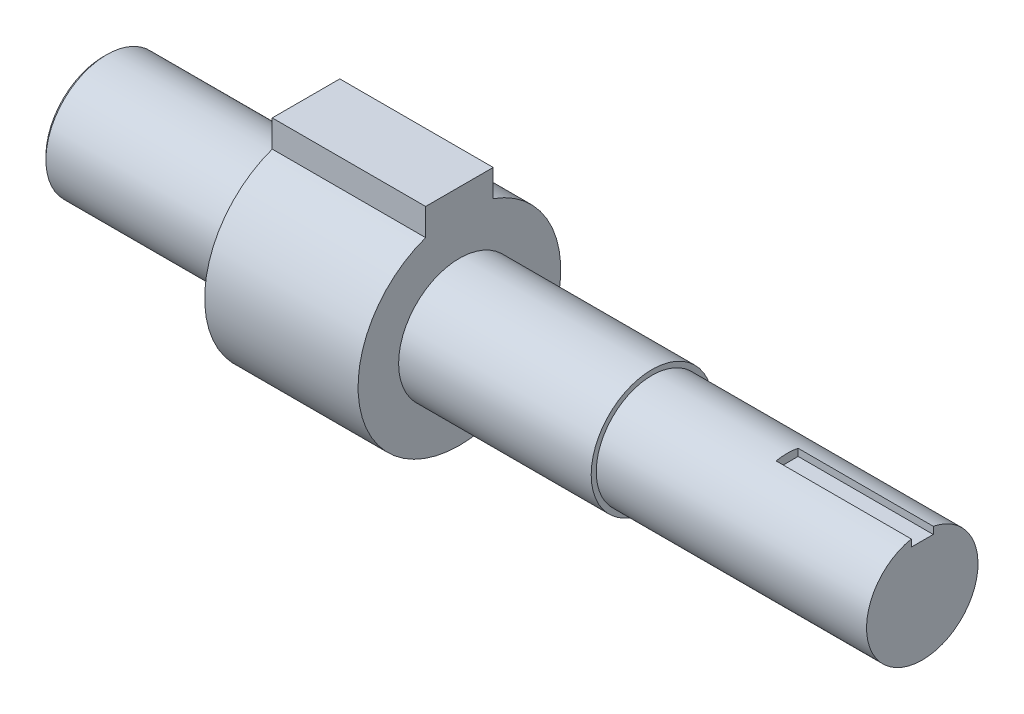
ISO-10303-21;
HEADER;
FILE_DESCRIPTION(('STEP AP214'),'2;1');
FILE_NAME('part.step','',(''),(''),'','','');
FILE_SCHEMA(('AUTOMOTIVE_DESIGN { 1 0 10303 214 1 1 1 1 }'));
ENDSEC;
DATA;
#1=APPLICATION_CONTEXT('core data for automotive mechanical design processes');
#2=APPLICATION_PROTOCOL_DEFINITION('international standard','automotive_design',2000,#1);
#3=PRODUCT_CONTEXT('',#1,'mechanical');
#4=PRODUCT('Part','Part','',(#3));
#5=PRODUCT_RELATED_PRODUCT_CATEGORY('part','',(#4));
#6=PRODUCT_DEFINITION_FORMATION('','',#4);
#7=PRODUCT_DEFINITION_CONTEXT('part definition',#1,'design');
#8=PRODUCT_DEFINITION('design','',#6,#7);
#9=PRODUCT_DEFINITION_SHAPE('','',#8);
#10=(LENGTH_UNIT() NAMED_UNIT(*) SI_UNIT(.MILLI.,.METRE.));
#11=(NAMED_UNIT(*) PLANE_ANGLE_UNIT() SI_UNIT($,.RADIAN.));
#12=(NAMED_UNIT(*) SI_UNIT($,.STERADIAN.) SOLID_ANGLE_UNIT());
#13=UNCERTAINTY_MEASURE_WITH_UNIT(LENGTH_MEASURE(1.E-05),#10,'distance_accuracy_value','');
#14=(GEOMETRIC_REPRESENTATION_CONTEXT(3) GLOBAL_UNCERTAINTY_ASSIGNED_CONTEXT((#13)) GLOBAL_UNIT_ASSIGNED_CONTEXT((#10,
#11,#12)) REPRESENTATION_CONTEXT('',''));
#15=CARTESIAN_POINT('',(0.,0.,0.));
#16=DIRECTION('',(0.,0.,1.));
#17=DIRECTION('',(1.,0.,0.));
#18=AXIS2_PLACEMENT_3D('',#15,#16,#17);
#19=CARTESIAN_POINT('',(0.,0.,0.));
#20=DIRECTION('',(1.,0.,0.));
#21=DIRECTION('',(0.,0.,-1.));
#22=AXIS2_PLACEMENT_3D('',#19,#20,#21);
#23=PLANE('',#22);
#24=CARTESIAN_POINT('',(0.,0.,0.));
#25=DIRECTION('',(1.,0.,0.));
#26=DIRECTION('',(0.,0.,-1.));
#27=AXIS2_PLACEMENT_3D('',#24,#25,#26);
#28=CIRCLE('',#27,8.49999999999998);
#29=CARTESIAN_POINT('',(0.,0.,-8.49999999999998));
#30=VERTEX_POINT('',#29);
#31=EDGE_CURVE('E42',#30,#30,#28,.F.);
#32=ORIENTED_EDGE('',*,*,#31,.T.);
#33=EDGE_LOOP('',(#32));
#34=FACE_BOUND('',#33,.T.);
#35=ADVANCED_FACE('F34',(#34),#23,.F.);
#36=CARTESIAN_POINT('',(0.,0.,0.));
#37=DIRECTION('',(-1.,0.,0.));
#38=DIRECTION('',(0.,0.,1.));
#39=AXIS2_PLACEMENT_3D('',#36,#37,#38);
#40=CYLINDRICAL_SURFACE('',#39,9.);
#41=CARTESIAN_POINT('',(0.500000000000023,0.,0.));
#42=DIRECTION('',(1.,0.,0.));
#43=DIRECTION('',(0.,0.,-1.));
#44=AXIS2_PLACEMENT_3D('',#41,#42,#43);
#45=CIRCLE('',#44,9.);
#46=CARTESIAN_POINT('',(0.500000000000023,0.,-9.));
#47=VERTEX_POINT('',#46);
#48=EDGE_CURVE('E11',#47,#47,#45,.T.);
#49=ORIENTED_EDGE('',*,*,#48,.T.);
#50=EDGE_LOOP('',(#49));
#51=FACE_BOUND('',#50,.T.);
#52=CARTESIAN_POINT('',(30.,0.,0.));
#53=DIRECTION('',(1.,0.,0.));
#54=DIRECTION('',(0.,0.,-1.));
#55=AXIS2_PLACEMENT_3D('',#52,#53,#54);
#56=CIRCLE('',#55,9.);
#57=CARTESIAN_POINT('',(30.,0.,-9.));
#58=VERTEX_POINT('',#57);
#59=EDGE_CURVE('E177',#58,#58,#56,.T.);
#60=ORIENTED_EDGE('',*,*,#59,.F.);
#61=EDGE_LOOP('',(#60));
#62=FACE_BOUND('',#61,.T.);
#63=ADVANCED_FACE('F193',(#51,#62),#40,.T.);
#64=CARTESIAN_POINT('',(52.7,0.,0.));
#65=DIRECTION('',(-1.,0.,0.));
#66=DIRECTION('',(0.,0.,1.));
#67=AXIS2_PLACEMENT_3D('',#64,#65,#66);
#68=CYLINDRICAL_SURFACE('',#67,15.);
#69=CARTESIAN_POINT('',(30.,0.,0.));
#70=DIRECTION('',(1.,0.,0.));
#71=DIRECTION('',(0.,0.,-1.));
#72=AXIS2_PLACEMENT_3D('',#69,#70,#71);
#73=CIRCLE('',#72,15.);
#74=CARTESIAN_POINT('',(30.,14.1421356237309,5.));
#75=VERTEX_POINT('',#74);
#76=CARTESIAN_POINT('',(30.,14.142135623731,-5.));
#77=VERTEX_POINT('',#76);
#78=EDGE_CURVE('E152',#75,#77,#73,.T.);
#79=ORIENTED_EDGE('',*,*,#78,.T.);
#80=DIRECTION('',(-1.,0.,0.));
#81=VECTOR('',#80,1.);
#82=CARTESIAN_POINT('',(52.7,14.142135623731,-5.));
#83=LINE('',#82,#81);
#84=CARTESIAN_POINT('',(52.7,14.142135623731,-5.));
#85=VERTEX_POINT('',#84);
#86=EDGE_CURVE('E175',#85,#77,#83,.T.);
#87=ORIENTED_EDGE('',*,*,#86,.F.);
#88=CARTESIAN_POINT('',(52.7,0.,0.));
#89=DIRECTION('',(1.,0.,0.));
#90=DIRECTION('',(0.,0.,-1.));
#91=AXIS2_PLACEMENT_3D('',#88,#89,#90);
#92=CIRCLE('',#91,15.);
#93=CARTESIAN_POINT('',(52.7,14.1421356237309,5.));
#94=VERTEX_POINT('',#93);
#95=EDGE_CURVE('E155',#94,#85,#92,.T.);
#96=ORIENTED_EDGE('',*,*,#95,.F.);
#97=DIRECTION('',(-1.,0.,0.));
#98=VECTOR('',#97,1.);
#99=CARTESIAN_POINT('',(52.7,14.1421356237309,5.));
#100=LINE('',#99,#98);
#101=EDGE_CURVE('E161',#94,#75,#100,.T.);
#102=ORIENTED_EDGE('',*,*,#101,.T.);
#103=EDGE_LOOP('',(#79,#87,#96,#102));
#104=FACE_BOUND('',#103,.T.);
#105=ADVANCED_FACE('F197',(#104),#68,.T.);
#106=CARTESIAN_POINT('',(52.7,18.142135623731,-5.));
#107=DIRECTION('',(0.,0.,1.));
#108=DIRECTION('',(0.,-1.,0.));
#109=AXIS2_PLACEMENT_3D('',#106,#107,#108);
#110=PLANE('',#109);
#111=DIRECTION('',(0.,1.,0.));
#112=VECTOR('',#111,1.);
#113=CARTESIAN_POINT('',(30.,18.142135623731,-5.));
#114=LINE('',#113,#112);
#115=CARTESIAN_POINT('',(30.,18.142135623731,-5.));
#116=VERTEX_POINT('',#115);
#117=EDGE_CURVE('E164',#77,#116,#114,.T.);
#118=ORIENTED_EDGE('',*,*,#117,.T.);
#119=DIRECTION('',(-1.,0.,0.));
#120=VECTOR('',#119,1.);
#121=CARTESIAN_POINT('',(52.7,18.142135623731,-5.));
#122=LINE('',#121,#120);
#123=CARTESIAN_POINT('',(52.7,18.142135623731,-5.));
#124=VERTEX_POINT('',#123);
#125=EDGE_CURVE('E172',#124,#116,#122,.T.);
#126=ORIENTED_EDGE('',*,*,#125,.F.);
#127=DIRECTION('',(0.,1.,0.));
#128=VECTOR('',#127,1.);
#129=CARTESIAN_POINT('',(52.7,18.142135623731,-5.));
#130=LINE('',#129,#128);
#131=EDGE_CURVE('E87',#85,#124,#130,.T.);
#132=ORIENTED_EDGE('',*,*,#131,.F.);
#133=ORIENTED_EDGE('',*,*,#86,.T.);
#134=EDGE_LOOP('',(#118,#126,#132,#133));
#135=FACE_BOUND('',#134,.T.);
#136=ADVANCED_FACE('F203',(#135),#110,.F.);
#137=CARTESIAN_POINT('',(52.7,18.142135623731,-5.));
#138=DIRECTION('',(0.,-1.,0.));
#139=DIRECTION('',(0.,0.,-1.));
#140=AXIS2_PLACEMENT_3D('',#137,#138,#139);
#141=PLANE('',#140);
#142=DIRECTION('',(0.,0.,1.));
#143=VECTOR('',#142,1.);
#144=CARTESIAN_POINT('',(30.,18.142135623731,-5.));
#145=LINE('',#144,#143);
#146=CARTESIAN_POINT('',(30.,18.142135623731,5.));
#147=VERTEX_POINT('',#146);
#148=EDGE_CURVE('E166',#116,#147,#145,.T.);
#149=ORIENTED_EDGE('',*,*,#148,.T.);
#150=DIRECTION('',(-1.,0.,0.));
#151=VECTOR('',#150,1.);
#152=CARTESIAN_POINT('',(52.7,18.142135623731,5.));
#153=LINE('',#152,#151);
#154=CARTESIAN_POINT('',(52.7,18.142135623731,5.));
#155=VERTEX_POINT('',#154);
#156=EDGE_CURVE('E170',#155,#147,#153,.T.);
#157=ORIENTED_EDGE('',*,*,#156,.F.);
#158=DIRECTION('',(0.,0.,1.));
#159=VECTOR('',#158,1.);
#160=CARTESIAN_POINT('',(52.7,18.142135623731,-5.));
#161=LINE('',#160,#159);
#162=EDGE_CURVE('E158',#124,#155,#161,.T.);
#163=ORIENTED_EDGE('',*,*,#162,.F.);
#164=ORIENTED_EDGE('',*,*,#125,.T.);
#165=EDGE_LOOP('',(#149,#157,#163,#164));
#166=FACE_BOUND('',#165,.T.);
#167=ADVANCED_FACE('F207',(#166),#141,.F.);
#168=CARTESIAN_POINT('',(52.7,18.142135623731,5.));
#169=DIRECTION('',(0.,0.,-1.));
#170=DIRECTION('',(0.,1.,0.));
#171=AXIS2_PLACEMENT_3D('',#168,#169,#170);
#172=PLANE('',#171);
#173=DIRECTION('',(0.,-1.,0.));
#174=VECTOR('',#173,1.);
#175=CARTESIAN_POINT('',(30.,18.142135623731,5.));
#176=LINE('',#175,#174);
#177=EDGE_CURVE('E79',#147,#75,#176,.T.);
#178=ORIENTED_EDGE('',*,*,#177,.T.);
#179=ORIENTED_EDGE('',*,*,#101,.F.);
#180=DIRECTION('',(0.,-1.,0.));
#181=VECTOR('',#180,1.);
#182=CARTESIAN_POINT('',(52.7,18.142135623731,5.));
#183=LINE('',#182,#181);
#184=EDGE_CURVE('E58',#155,#94,#183,.T.);
#185=ORIENTED_EDGE('',*,*,#184,.F.);
#186=ORIENTED_EDGE('',*,*,#156,.T.);
#187=EDGE_LOOP('',(#178,#179,#185,#186));
#188=FACE_BOUND('',#187,.T.);
#189=ADVANCED_FACE('F210',(#188),#172,.F.);
#190=CARTESIAN_POINT('',(52.7,0.,0.));
#191=DIRECTION('',(1.,0.,0.));
#192=DIRECTION('',(0.,0.,-1.));
#193=AXIS2_PLACEMENT_3D('',#190,#191,#192);
#194=PLANE('',#193);
#195=CARTESIAN_POINT('',(52.7,0.,0.));
#196=DIRECTION('',(1.,0.,0.));
#197=DIRECTION('',(0.,0.,-1.));
#198=AXIS2_PLACEMENT_3D('',#195,#196,#197);
#199=CIRCLE('',#198,9.);
#200=CARTESIAN_POINT('',(52.7,0.,9.));
#201=VERTEX_POINT('',#200);
#202=EDGE_CURVE('E146',#201,#201,#199,.T.);
#203=ORIENTED_EDGE('',*,*,#202,.F.);
#204=EDGE_LOOP('',(#203));
#205=FACE_BOUND('',#204,.T.);
#206=ORIENTED_EDGE('',*,*,#95,.T.);
#207=ORIENTED_EDGE('',*,*,#131,.T.);
#208=ORIENTED_EDGE('',*,*,#162,.T.);
#209=ORIENTED_EDGE('',*,*,#184,.T.);
#210=EDGE_LOOP('',(#206,#207,#208,#209));
#211=FACE_BOUND('',#210,.T.);
#212=ADVANCED_FACE('F214',(#205,#211),#194,.T.);
#213=CARTESIAN_POINT('',(30.,0.,0.));
#214=DIRECTION('',(1.,0.,0.));
#215=DIRECTION('',(0.,0.,-1.));
#216=AXIS2_PLACEMENT_3D('',#213,#214,#215);
#217=PLANE('',#216);
#218=ORIENTED_EDGE('',*,*,#59,.T.);
#219=EDGE_LOOP('',(#218));
#220=FACE_BOUND('',#219,.T.);
#221=ORIENTED_EDGE('',*,*,#78,.F.);
#222=ORIENTED_EDGE('',*,*,#177,.F.);
#223=ORIENTED_EDGE('',*,*,#148,.F.);
#224=ORIENTED_EDGE('',*,*,#117,.F.);
#225=EDGE_LOOP('',(#221,#222,#223,#224));
#226=FACE_BOUND('',#225,.T.);
#227=ADVANCED_FACE('F215',(#220,#226),#217,.F.);
#228=CARTESIAN_POINT('',(81.2,0.,0.));
#229=DIRECTION('',(-1.,0.,0.));
#230=DIRECTION('',(0.,0.,1.));
#231=AXIS2_PLACEMENT_3D('',#228,#229,#230);
#232=CYLINDRICAL_SURFACE('',#231,9.);
#233=CARTESIAN_POINT('',(81.2,0.,0.));
#234=DIRECTION('',(1.,0.,0.));
#235=DIRECTION('',(0.,0.,-1.));
#236=AXIS2_PLACEMENT_3D('',#233,#234,#235);
#237=CIRCLE('',#236,9.);
#238=CARTESIAN_POINT('',(81.2,0.,9.));
#239=VERTEX_POINT('',#238);
#240=EDGE_CURVE('E149',#239,#239,#237,.T.);
#241=CARTESIAN_POINT('',(81.2,0.,9.));
#242=CARTESIAN_POINT('',(80.903125,0.,9.));
#243=CARTESIAN_POINT('',(80.60625,0.,9.));
#244=CARTESIAN_POINT('',(80.0125,0.,9.));
#245=CARTESIAN_POINT('',(79.715625,0.,9.));
#246=CARTESIAN_POINT('',(79.121875,0.,9.));
#247=CARTESIAN_POINT('',(78.825,0.,9.));
#248=CARTESIAN_POINT('',(78.23125,0.,9.));
#249=CARTESIAN_POINT('',(77.934375,0.,9.));
#250=CARTESIAN_POINT('',(77.340625,0.,9.));
#251=CARTESIAN_POINT('',(77.04375,0.,9.));
#252=CARTESIAN_POINT('',(76.45,0.,9.));
#253=CARTESIAN_POINT('',(76.153125,0.,9.));
#254=CARTESIAN_POINT('',(75.559375,0.,9.));
#255=CARTESIAN_POINT('',(75.2625,0.,9.));
#256=CARTESIAN_POINT('',(74.66875,0.,9.));
#257=CARTESIAN_POINT('',(74.371875,0.,9.));
#258=CARTESIAN_POINT('',(73.778125,0.,9.));
#259=CARTESIAN_POINT('',(73.48125,0.,9.));
#260=CARTESIAN_POINT('',(72.8875,0.,9.));
#261=CARTESIAN_POINT('',(72.590625,0.,9.));
#262=CARTESIAN_POINT('',(71.996875,0.,9.));
#263=CARTESIAN_POINT('',(71.7,0.,9.));
#264=CARTESIAN_POINT('',(71.10625,0.,9.));
#265=CARTESIAN_POINT('',(70.809375,0.,9.));
#266=CARTESIAN_POINT('',(70.215625,0.,9.));
#267=CARTESIAN_POINT('',(69.91875,0.,9.));
#268=CARTESIAN_POINT('',(69.325,0.,9.));
#269=CARTESIAN_POINT('',(69.028125,0.,9.));
#270=CARTESIAN_POINT('',(68.434375,0.,9.));
#271=CARTESIAN_POINT('',(68.1375,0.,9.));
#272=CARTESIAN_POINT('',(67.54375,0.,9.));
#273=CARTESIAN_POINT('',(67.246875,0.,9.));
#274=CARTESIAN_POINT('',(66.653125,0.,9.));
#275=CARTESIAN_POINT('',(66.35625,0.,9.));
#276=CARTESIAN_POINT('',(65.7625,0.,9.));
#277=CARTESIAN_POINT('',(65.465625,0.,9.));
#278=CARTESIAN_POINT('',(64.871875,0.,9.));
#279=CARTESIAN_POINT('',(64.575,0.,9.));
#280=CARTESIAN_POINT('',(63.98125,0.,9.));
#281=CARTESIAN_POINT('',(63.684375,0.,9.));
#282=CARTESIAN_POINT('',(63.090625,0.,9.));
#283=CARTESIAN_POINT('',(62.79375,0.,9.));
#284=CARTESIAN_POINT('',(62.2,0.,9.));
#285=CARTESIAN_POINT('',(61.903125,0.,9.));
#286=CARTESIAN_POINT('',(61.309375,0.,9.));
#287=CARTESIAN_POINT('',(61.0125,0.,9.));
#288=CARTESIAN_POINT('',(60.41875,0.,9.));
#289=CARTESIAN_POINT('',(60.121875,0.,9.));
#290=CARTESIAN_POINT('',(59.528125,0.,9.));
#291=CARTESIAN_POINT('',(59.23125,0.,9.));
#292=CARTESIAN_POINT('',(58.6375,0.,9.));
#293=CARTESIAN_POINT('',(58.340625,0.,9.));
#294=CARTESIAN_POINT('',(57.746875,0.,9.));
#295=CARTESIAN_POINT('',(57.45,0.,9.));
#296=CARTESIAN_POINT('',(56.85625,0.,9.));
#297=CARTESIAN_POINT('',(56.559375,0.,9.));
#298=CARTESIAN_POINT('',(55.965625,0.,9.));
#299=CARTESIAN_POINT('',(55.66875,0.,9.));
#300=CARTESIAN_POINT('',(55.075,0.,9.));
#301=CARTESIAN_POINT('',(54.778125,0.,9.));
#302=CARTESIAN_POINT('',(54.184375,0.,9.));
#303=CARTESIAN_POINT('',(53.8875,0.,9.));
#304=CARTESIAN_POINT('',(53.29375,0.,9.));
#305=CARTESIAN_POINT('',(52.996875,0.,9.));
#306=CARTESIAN_POINT('',(52.7,0.,9.));
#307=B_SPLINE_CURVE_WITH_KNOTS('',3,(#241,#242,#243,#244,#245,#246,#247,#248,#249,#250,#251,
#252,#253,#254,#255,#256,#257,#258,#259,#260,#261,#262,#263,#264,#265,#266,#267,#268,#269,#270,
#271,#272,#273,#274,#275,#276,#277,#278,#279,#280,#281,#282,#283,#284,#285,#286,#287,#288,#289,
#290,#291,#292,#293,#294,#295,#296,#297,#298,#299,#300,#301,#302,#303,#304,#305,#306),
.UNSPECIFIED.,.F.,.F.,(4,2,2,2,2,2,2,2,2,2,2,2,2,2,2,2,2,2,2,2,2,2,2,2,2,2,2,2,2,2,2,2,4),(0.,
0.890625000000006,1.78125000000001,2.671875,3.56250000000001,4.453125,5.34375000000001,6.234375,
7.12500000000001,8.015625,8.90625,9.79687500000001,10.6875,11.578125,12.46875,13.359375,14.25,
15.140625,16.03125,16.921875,17.8125,18.703125,19.59375,20.484375,21.375,22.265625,23.15625,
24.046875,24.9375,25.828125,26.71875,27.609375,28.5),.UNSPECIFIED.);
#308=EDGE_CURVE('BSEAM218',#239,#201,#307,.T.);
#309=ORIENTED_EDGE('',*,*,#240,.F.);
#310=ORIENTED_EDGE('',*,*,#202,.T.);
#311=ORIENTED_EDGE('',*,*,#308,.T.);
#312=ORIENTED_EDGE('',*,*,#308,.F.);
#313=EDGE_LOOP('',(#309,#311,#310,#312));
#314=FACE_BOUND('',#313,.T.);
#315=ADVANCED_FACE('F218',(#314),#232,.T.);
#316=CARTESIAN_POINT('',(81.2,0.,0.));
#317=DIRECTION('',(1.,0.,0.));
#318=DIRECTION('',(0.,0.,-1.));
#319=AXIS2_PLACEMENT_3D('',#316,#317,#318);
#320=PLANE('',#319);
#321=CARTESIAN_POINT('',(81.2,0.,0.));
#322=DIRECTION('',(1.,0.,0.));
#323=DIRECTION('',(0.,0.,-1.));
#324=AXIS2_PLACEMENT_3D('',#321,#322,#323);
#325=CIRCLE('',#324,8.25);
#326=CARTESIAN_POINT('',(81.2,0.,-8.25));
#327=VERTEX_POINT('',#326);
#328=EDGE_CURVE('E142',#327,#327,#325,.T.);
#329=ORIENTED_EDGE('',*,*,#328,.F.);
#330=EDGE_LOOP('',(#329));
#331=FACE_BOUND('',#330,.T.);
#332=ORIENTED_EDGE('',*,*,#240,.T.);
#333=EDGE_LOOP('',(#332));
#334=FACE_BOUND('',#333,.T.);
#335=ADVANCED_FACE('F225',(#331,#334),#320,.T.);
#336=CARTESIAN_POINT('',(121.2,0.,0.));
#337=DIRECTION('',(-1.,0.,0.));
#338=DIRECTION('',(0.,0.,1.));
#339=AXIS2_PLACEMENT_3D('',#336,#337,#338);
#340=CYLINDRICAL_SURFACE('',#339,8.25);
#341=CARTESIAN_POINT('',(101.2,0.,0.));
#342=DIRECTION('',(1.,0.,0.));
#343=DIRECTION('',(0.,0.,-1.));
#344=AXIS2_PLACEMENT_3D('',#341,#342,#343);
#345=CIRCLE('',#344,8.25);
#346=CARTESIAN_POINT('',(101.2,8.08837900941839,-1.625));
#347=VERTEX_POINT('',#346);
#348=CARTESIAN_POINT('',(101.2,8.08837900941839,1.625));
#349=VERTEX_POINT('',#348);
#350=EDGE_CURVE('E116',#347,#349,#345,.T.);
#351=ORIENTED_EDGE('',*,*,#350,.F.);
#352=DIRECTION('',(-1.,0.,0.));
#353=VECTOR('',#352,1.);
#354=CARTESIAN_POINT('',(121.2,8.08837900941839,-1.625));
#355=LINE('',#354,#353);
#356=CARTESIAN_POINT('',(121.2,8.08837900941839,-1.625));
#357=VERTEX_POINT('',#356);
#358=EDGE_CURVE('E139',#347,#357,#355,.F.);
#359=ORIENTED_EDGE('',*,*,#358,.T.);
#360=CARTESIAN_POINT('',(121.2,0.,0.));
#361=DIRECTION('',(1.,0.,0.));
#362=DIRECTION('',(0.,0.,-1.));
#363=AXIS2_PLACEMENT_3D('',#360,#361,#362);
#364=CIRCLE('',#363,8.25);
#365=CARTESIAN_POINT('',(121.2,8.08837900941839,1.625));
#366=VERTEX_POINT('',#365);
#367=EDGE_CURVE('E143',#366,#357,#364,.T.);
#368=ORIENTED_EDGE('',*,*,#367,.F.);
#369=DIRECTION('',(-1.,0.,0.));
#370=VECTOR('',#369,1.);
#371=CARTESIAN_POINT('',(121.2,8.08837900941839,1.625));
#372=LINE('',#371,#370);
#373=EDGE_CURVE('E49',#366,#349,#372,.T.);
#374=ORIENTED_EDGE('',*,*,#373,.T.);
#375=EDGE_LOOP('',(#351,#359,#368,#374));
#376=FACE_BOUND('',#375,.T.);
#377=ORIENTED_EDGE('',*,*,#328,.T.);
#378=EDGE_LOOP('',(#377));
#379=FACE_BOUND('',#378,.T.);
#380=ADVANCED_FACE('F229',(#376,#379),#340,.T.);
#381=CARTESIAN_POINT('',(121.2,0.,0.));
#382=DIRECTION('',(1.,0.,0.));
#383=DIRECTION('',(0.,0.,-1.));
#384=AXIS2_PLACEMENT_3D('',#381,#382,#383);
#385=PLANE('',#384);
#386=DIRECTION('',(0.,1.,0.));
#387=VECTOR('',#386,1.);
#388=CARTESIAN_POINT('',(121.2,8.54,-1.625));
#389=LINE('',#388,#387);
#390=CARTESIAN_POINT('',(121.2,7.04,-1.625));
#391=VERTEX_POINT('',#390);
#392=EDGE_CURVE('E133',#391,#357,#389,.T.);
#393=ORIENTED_EDGE('',*,*,#392,.F.);
#394=DIRECTION('',(0.,0.,-1.));
#395=VECTOR('',#394,1.);
#396=CARTESIAN_POINT('',(121.2,7.04,1.625));
#397=LINE('',#396,#395);
#398=CARTESIAN_POINT('',(121.2,7.04,1.625));
#399=VERTEX_POINT('',#398);
#400=EDGE_CURVE('E135',#399,#391,#397,.T.);
#401=ORIENTED_EDGE('',*,*,#400,.F.);
#402=DIRECTION('',(0.,-1.,0.));
#403=VECTOR('',#402,1.);
#404=CARTESIAN_POINT('',(121.2,0.,1.625));
#405=LINE('',#404,#403);
#406=EDGE_CURVE('E122',#366,#399,#405,.T.);
#407=ORIENTED_EDGE('',*,*,#406,.F.);
#408=ORIENTED_EDGE('',*,*,#367,.T.);
#409=EDGE_LOOP('',(#393,#401,#407,#408));
#410=FACE_BOUND('',#409,.T.);
#411=ADVANCED_FACE('F233',(#410),#385,.T.);
#412=CARTESIAN_POINT('',(101.2,0.,0.));
#413=DIRECTION('',(1.,0.,0.));
#414=DIRECTION('',(0.,0.,-1.));
#415=AXIS2_PLACEMENT_3D('',#412,#413,#414);
#416=PLANE('',#415);
#417=ORIENTED_EDGE('',*,*,#350,.T.);
#418=DIRECTION('',(0.,-1.,0.));
#419=VECTOR('',#418,1.);
#420=CARTESIAN_POINT('',(101.2,8.54,1.625));
#421=LINE('',#420,#419);
#422=CARTESIAN_POINT('',(101.2,7.04,1.625));
#423=VERTEX_POINT('',#422);
#424=EDGE_CURVE('E109',#349,#423,#421,.T.);
#425=ORIENTED_EDGE('',*,*,#424,.T.);
#426=DIRECTION('',(0.,0.,-1.));
#427=VECTOR('',#426,1.);
#428=CARTESIAN_POINT('',(101.2,7.04,1.625));
#429=LINE('',#428,#427);
#430=CARTESIAN_POINT('',(101.2,7.04,-1.625));
#431=VERTEX_POINT('',#430);
#432=EDGE_CURVE('E114',#423,#431,#429,.T.);
#433=ORIENTED_EDGE('',*,*,#432,.T.);
#434=DIRECTION('',(0.,1.,0.));
#435=VECTOR('',#434,1.);
#436=CARTESIAN_POINT('',(101.2,8.54,-1.625));
#437=LINE('',#436,#435);
#438=EDGE_CURVE('E117',#431,#347,#437,.T.);
#439=ORIENTED_EDGE('',*,*,#438,.T.);
#440=EDGE_LOOP('',(#417,#425,#433,#439));
#441=FACE_BOUND('',#440,.T.);
#442=ADVANCED_FACE('F111',(#441),#416,.T.);
#443=CARTESIAN_POINT('',(101.2,8.54,-1.625));
#444=DIRECTION('',(0.,0.,-1.));
#445=DIRECTION('',(-1.,0.,0.));
#446=AXIS2_PLACEMENT_3D('',#443,#444,#445);
#447=PLANE('',#446);
#448=ORIENTED_EDGE('',*,*,#438,.F.);
#449=DIRECTION('',(1.,0.,0.));
#450=VECTOR('',#449,1.);
#451=CARTESIAN_POINT('',(101.2,7.04,-1.625));
#452=LINE('',#451,#450);
#453=EDGE_CURVE('E126',#431,#391,#452,.T.);
#454=ORIENTED_EDGE('',*,*,#453,.T.);
#455=ORIENTED_EDGE('',*,*,#392,.T.);
#456=ORIENTED_EDGE('',*,*,#358,.F.);
#457=EDGE_LOOP('',(#448,#454,#455,#456));
#458=FACE_BOUND('',#457,.T.);
#459=ADVANCED_FACE('F238',(#458),#447,.F.);
#460=CARTESIAN_POINT('',(101.2,8.54,1.625));
#461=DIRECTION('',(0.,0.,1.));
#462=DIRECTION('',(0.,-1.,0.));
#463=AXIS2_PLACEMENT_3D('',#460,#461,#462);
#464=PLANE('',#463);
#465=ORIENTED_EDGE('',*,*,#406,.T.);
#466=DIRECTION('',(1.,0.,0.));
#467=VECTOR('',#466,1.);
#468=CARTESIAN_POINT('',(101.2,7.04,1.625));
#469=LINE('',#468,#467);
#470=EDGE_CURVE('E120',#423,#399,#469,.T.);
#471=ORIENTED_EDGE('',*,*,#470,.F.);
#472=ORIENTED_EDGE('',*,*,#424,.F.);
#473=ORIENTED_EDGE('',*,*,#373,.F.);
#474=EDGE_LOOP('',(#465,#471,#472,#473));
#475=FACE_BOUND('',#474,.T.);
#476=ADVANCED_FACE('F121',(#475),#464,.F.);
#477=CARTESIAN_POINT('',(101.2,7.04,1.625));
#478=DIRECTION('',(0.,-1.,0.));
#479=DIRECTION('',(0.,0.,-1.));
#480=AXIS2_PLACEMENT_3D('',#477,#478,#479);
#481=PLANE('',#480);
#482=ORIENTED_EDGE('',*,*,#400,.T.);
#483=ORIENTED_EDGE('',*,*,#453,.F.);
#484=ORIENTED_EDGE('',*,*,#432,.F.);
#485=ORIENTED_EDGE('',*,*,#470,.T.);
#486=EDGE_LOOP('',(#482,#483,#484,#485));
#487=FACE_BOUND('',#486,.T.);
#488=ADVANCED_FACE('F128',(#487),#481,.F.);
#489=CARTESIAN_POINT('',(0.,0.,0.));
#490=DIRECTION('',(1.,0.,0.));
#491=DIRECTION('',(0.,0.,-1.));
#492=AXIS2_PLACEMENT_3D('',#489,#490,#491);
#493=CONICAL_SURFACE('',#492,8.49999999999998,0.785398163397445);
#494=ORIENTED_EDGE('',*,*,#48,.F.);
#495=EDGE_LOOP('',(#494));
#496=FACE_BOUND('',#495,.T.);
#497=ORIENTED_EDGE('',*,*,#31,.F.);
#498=EDGE_LOOP('',(#497));
#499=FACE_BOUND('',#498,.T.);
#500=ADVANCED_FACE('F36',(#496,#499),#493,.T.);
#501=CLOSED_SHELL('',(#35,#63,#105,#136,#167,#189,#212,#227,#315,#335,#380,#411,#442,#459,#476,
#488,#500));
#502=MANIFOLD_SOLID_BREP('B2',#501);
#503=ADVANCED_BREP_SHAPE_REPRESENTATION('',(#18,#502),#14);
#504=SHAPE_DEFINITION_REPRESENTATION(#9,#503);
ENDSEC;
END-ISO-10303-21;
